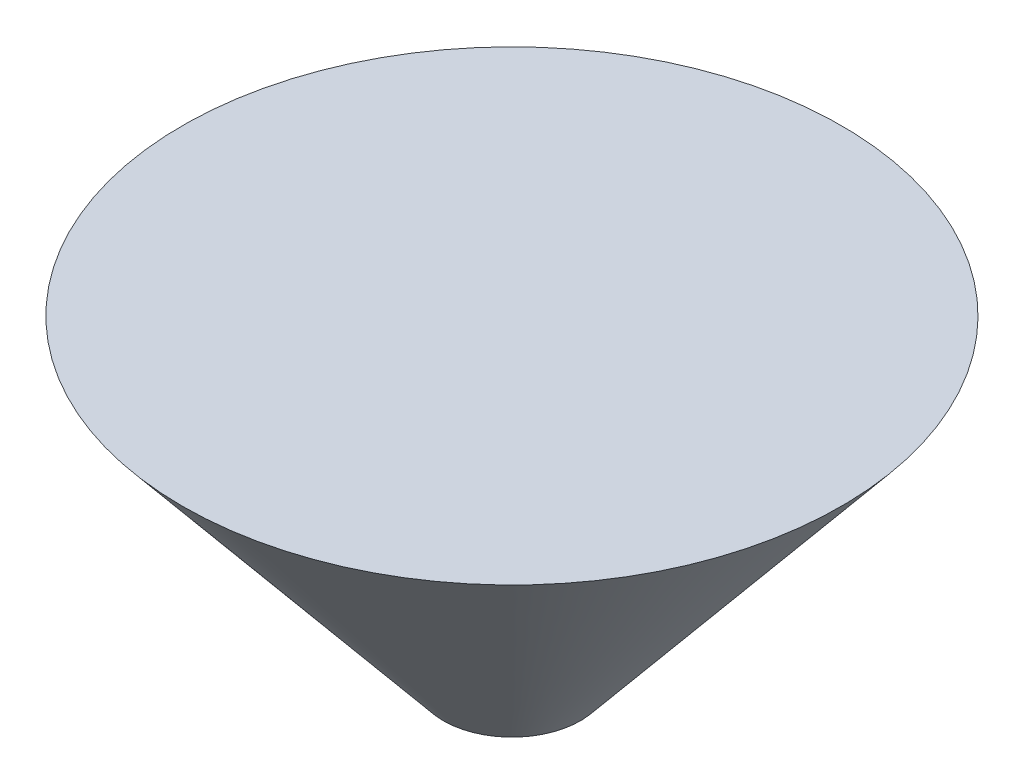
ISO-10303-21;
HEADER;
FILE_DESCRIPTION(('STEP AP214'),'2;1');
FILE_NAME('part.step','',(''),(''),'','','');
FILE_SCHEMA(('AUTOMOTIVE_DESIGN { 1 0 10303 214 1 1 1 1 }'));
ENDSEC;
DATA;
#1=APPLICATION_CONTEXT('core data for automotive mechanical design processes');
#2=APPLICATION_PROTOCOL_DEFINITION('international standard','automotive_design',2000,#1);
#3=PRODUCT_CONTEXT('',#1,'mechanical');
#4=PRODUCT('Part','Part','',(#3));
#5=PRODUCT_RELATED_PRODUCT_CATEGORY('part','',(#4));
#6=PRODUCT_DEFINITION_FORMATION('','',#4);
#7=PRODUCT_DEFINITION_CONTEXT('part definition',#1,'design');
#8=PRODUCT_DEFINITION('design','',#6,#7);
#9=PRODUCT_DEFINITION_SHAPE('','',#8);
#10=(LENGTH_UNIT() NAMED_UNIT(*) SI_UNIT(.MILLI.,.METRE.));
#11=(NAMED_UNIT(*) PLANE_ANGLE_UNIT() SI_UNIT($,.RADIAN.));
#12=(NAMED_UNIT(*) SI_UNIT($,.STERADIAN.) SOLID_ANGLE_UNIT());
#13=UNCERTAINTY_MEASURE_WITH_UNIT(LENGTH_MEASURE(1.E-05),#10,'distance_accuracy_value','');
#14=(GEOMETRIC_REPRESENTATION_CONTEXT(3) GLOBAL_UNCERTAINTY_ASSIGNED_CONTEXT((#13)) GLOBAL_UNIT_ASSIGNED_CONTEXT((#10,
#11,#12)) REPRESENTATION_CONTEXT('',''));
#15=CARTESIAN_POINT('',(0.,0.,0.));
#16=DIRECTION('',(0.,0.,1.));
#17=DIRECTION('',(1.,0.,0.));
#18=AXIS2_PLACEMENT_3D('',#15,#16,#17);
#19=CARTESIAN_POINT('',(0.,0.,0.));
#20=DIRECTION('',(0.,1.,0.));
#21=DIRECTION('',(0.,0.,1.));
#22=AXIS2_PLACEMENT_3D('',#19,#20,#21);
#23=PLANE('',#22);
#24=CARTESIAN_POINT('',(0.,0.,0.));
#25=DIRECTION('',(0.,-1.,0.));
#26=DIRECTION('',(0.,0.,-1.));
#27=AXIS2_PLACEMENT_3D('',#24,#25,#26);
#28=CIRCLE('',#27,12.5);
#29=CARTESIAN_POINT('',(0.,0.,12.5));
#30=VERTEX_POINT('',#29);
#31=EDGE_CURVE('E10',#30,#30,#28,.T.);
#32=ORIENTED_EDGE('',*,*,#31,.F.);
#33=EDGE_LOOP('',(#32));
#34=FACE_BOUND('',#33,.T.);
#35=ADVANCED_FACE('F31',(#34),#23,.T.);
#36=CARTESIAN_POINT('',(0.,-12.,0.));
#37=DIRECTION('',(0.,1.,0.));
#38=DIRECTION('',(0.,0.,1.));
#39=AXIS2_PLACEMENT_3D('',#36,#37,#38);
#40=CONICAL_SURFACE('',#39,2.6,0.689800044733608);
#41=CARTESIAN_POINT('',(0.,-12.,0.));
#42=DIRECTION('',(0.,-1.,0.));
#43=DIRECTION('',(0.,0.,-1.));
#44=AXIS2_PLACEMENT_3D('',#41,#42,#43);
#45=CIRCLE('',#44,2.6);
#46=CARTESIAN_POINT('',(0.,-12.,2.6));
#47=VERTEX_POINT('',#46);
#48=EDGE_CURVE('E37',#47,#47,#45,.T.);
#49=CARTESIAN_POINT('',(0.,0.,12.5));
#50=CARTESIAN_POINT('',(0.,-0.125,12.396875));
#51=CARTESIAN_POINT('',(0.,-0.25,12.29375));
#52=CARTESIAN_POINT('',(0.,-0.5,12.0875));
#53=CARTESIAN_POINT('',(0.,-0.625000000000001,11.984375));
#54=CARTESIAN_POINT('',(0.,-0.875,11.778125));
#55=CARTESIAN_POINT('',(0.,-1.,11.675));
#56=CARTESIAN_POINT('',(0.,-1.25,11.46875));
#57=CARTESIAN_POINT('',(0.,-1.375,11.365625));
#58=CARTESIAN_POINT('',(0.,-1.625,11.159375));
#59=CARTESIAN_POINT('',(0.,-1.75,11.05625));
#60=CARTESIAN_POINT('',(0.,-2.,10.85));
#61=CARTESIAN_POINT('',(0.,-2.125,10.746875));
#62=CARTESIAN_POINT('',(0.,-2.375,10.540625));
#63=CARTESIAN_POINT('',(0.,-2.5,10.4375));
#64=CARTESIAN_POINT('',(0.,-2.75,10.23125));
#65=CARTESIAN_POINT('',(0.,-2.875,10.128125));
#66=CARTESIAN_POINT('',(0.,-3.125,9.921875));
#67=CARTESIAN_POINT('',(0.,-3.25,9.81875));
#68=CARTESIAN_POINT('',(0.,-3.5,9.6125));
#69=CARTESIAN_POINT('',(0.,-3.625,9.509375));
#70=CARTESIAN_POINT('',(0.,-3.875,9.303125));
#71=CARTESIAN_POINT('',(0.,-4.,9.2));
#72=CARTESIAN_POINT('',(0.,-4.25,8.99375));
#73=CARTESIAN_POINT('',(0.,-4.375,8.890625));
#74=CARTESIAN_POINT('',(0.,-4.625,8.684375));
#75=CARTESIAN_POINT('',(0.,-4.75,8.58125));
#76=CARTESIAN_POINT('',(0.,-5.,8.375));
#77=CARTESIAN_POINT('',(0.,-5.125,8.271875));
#78=CARTESIAN_POINT('',(0.,-5.375,8.065625));
#79=CARTESIAN_POINT('',(0.,-5.5,7.9625));
#80=CARTESIAN_POINT('',(0.,-5.75,7.75625));
#81=CARTESIAN_POINT('',(0.,-5.875,7.653125));
#82=CARTESIAN_POINT('',(0.,-6.125,7.446875));
#83=CARTESIAN_POINT('',(0.,-6.25,7.34375));
#84=CARTESIAN_POINT('',(0.,-6.5,7.1375));
#85=CARTESIAN_POINT('',(0.,-6.625,7.034375));
#86=CARTESIAN_POINT('',(0.,-6.875,6.828125));
#87=CARTESIAN_POINT('',(0.,-7.,6.725));
#88=CARTESIAN_POINT('',(0.,-7.25,6.51875));
#89=CARTESIAN_POINT('',(0.,-7.375,6.415625));
#90=CARTESIAN_POINT('',(0.,-7.625,6.209375));
#91=CARTESIAN_POINT('',(0.,-7.75,6.10625));
#92=CARTESIAN_POINT('',(0.,-8.,5.9));
#93=CARTESIAN_POINT('',(0.,-8.125,5.796875));
#94=CARTESIAN_POINT('',(0.,-8.375,5.590625));
#95=CARTESIAN_POINT('',(0.,-8.5,5.4875));
#96=CARTESIAN_POINT('',(0.,-8.75,5.28125));
#97=CARTESIAN_POINT('',(0.,-8.875,5.178125));
#98=CARTESIAN_POINT('',(0.,-9.125,4.971875));
#99=CARTESIAN_POINT('',(0.,-9.25,4.86875));
#100=CARTESIAN_POINT('',(0.,-9.5,4.6625));
#101=CARTESIAN_POINT('',(0.,-9.625,4.559375));
#102=CARTESIAN_POINT('',(0.,-9.875,4.353125));
#103=CARTESIAN_POINT('',(0.,-10.,4.25));
#104=CARTESIAN_POINT('',(0.,-10.25,4.04375));
#105=CARTESIAN_POINT('',(0.,-10.375,3.940625));
#106=CARTESIAN_POINT('',(0.,-10.625,3.734375));
#107=CARTESIAN_POINT('',(0.,-10.75,3.63125));
#108=CARTESIAN_POINT('',(0.,-11.,3.425));
#109=CARTESIAN_POINT('',(0.,-11.125,3.321875));
#110=CARTESIAN_POINT('',(0.,-11.375,3.115625));
#111=CARTESIAN_POINT('',(0.,-11.5,3.0125));
#112=CARTESIAN_POINT('',(0.,-11.75,2.80625));
#113=CARTESIAN_POINT('',(0.,-11.875,2.703125));
#114=CARTESIAN_POINT('',(0.,-12.,2.6));
#115=B_SPLINE_CURVE_WITH_KNOTS('',3,(#49,#50,#51,#52,#53,#54,#55,#56,#57,#58,#59,#60,#61,#62,
#63,#64,#65,#66,#67,#68,#69,#70,#71,#72,#73,#74,#75,#76,#77,#78,#79,#80,#81,#82,#83,#84,#85,#86,
#87,#88,#89,#90,#91,#92,#93,#94,#95,#96,#97,#98,#99,#100,#101,#102,#103,#104,#105,#106,#107,
#108,#109,#110,#111,#112,#113,#114),.UNSPECIFIED.,.F.,.F.,(4,2,2,2,2,2,2,2,2,2,2,2,2,2,2,2,2,2,
2,2,2,2,2,2,2,2,2,2,2,2,2,2,4),(0.,0.486145956092407,0.972291912184814,1.45843786827722,
1.94458382436963,2.43072978046203,2.91687573655444,3.40302169264684,3.88916764873925,
4.37531360483166,4.86145956092407,5.34760551701647,5.83375147310888,6.31989742920128,
6.80604338529369,7.2921893413861,7.7783352974785,8.26448125357091,8.75062720966332,
9.23677316575572,9.72291912184813,10.2090650779405,10.6952110340329,11.1813569901253,
11.6675029462178,12.1536489023102,12.6397948584026,13.125940814495,13.6120867705874,
14.0982327266798,14.5843786827722,15.0705246388646,15.556670594957),.UNSPECIFIED.);
#116=EDGE_CURVE('BSEAM45',#30,#47,#115,.T.);
#117=ORIENTED_EDGE('',*,*,#31,.T.);
#118=ORIENTED_EDGE('',*,*,#48,.F.);
#119=ORIENTED_EDGE('',*,*,#116,.T.);
#120=ORIENTED_EDGE('',*,*,#116,.F.);
#121=EDGE_LOOP('',(#117,#119,#118,#120));
#122=FACE_BOUND('',#121,.T.);
#123=ADVANCED_FACE('F45',(#122),#40,.T.);
#124=CARTESIAN_POINT('',(2.6,-12.,0.));
#125=DIRECTION('',(0.,-1.,0.));
#126=DIRECTION('',(0.,0.,-1.));
#127=AXIS2_PLACEMENT_3D('',#124,#125,#126);
#128=PLANE('',#127);
#129=ORIENTED_EDGE('',*,*,#48,.T.);
#130=EDGE_LOOP('',(#129));
#131=FACE_BOUND('',#130,.T.);
#132=ADVANCED_FACE('F43',(#131),#128,.T.);
#133=CLOSED_SHELL('',(#35,#123,#132));
#134=MANIFOLD_SOLID_BREP('B2',#133);
#135=ADVANCED_BREP_SHAPE_REPRESENTATION('',(#18,#134),#14);
#136=SHAPE_DEFINITION_REPRESENTATION(#9,#135);
ENDSEC;
END-ISO-10303-21;
